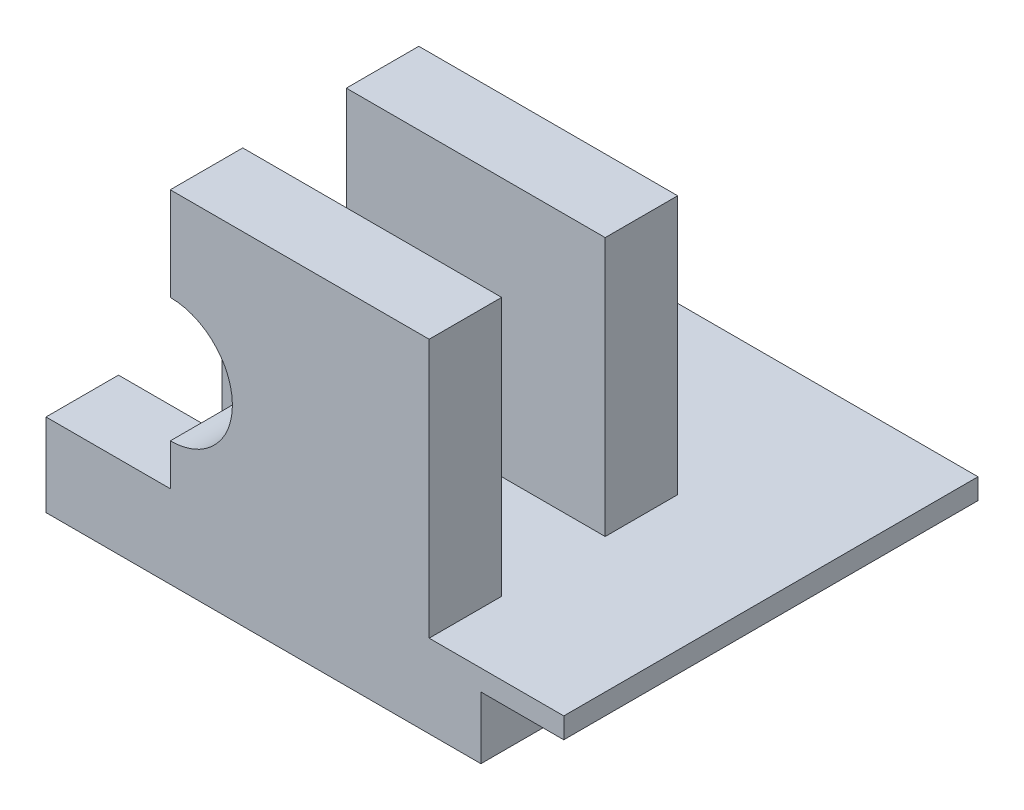
ISO-10303-21;
HEADER;
FILE_DESCRIPTION(('STEP AP214'),'2;1');
FILE_NAME('part.step','',(''),(''),'','','');
FILE_SCHEMA(('AUTOMOTIVE_DESIGN { 1 0 10303 214 1 1 1 1 }'));
ENDSEC;
DATA;
#1=APPLICATION_CONTEXT('core data for automotive mechanical design processes');
#2=APPLICATION_PROTOCOL_DEFINITION('international standard','automotive_design',2000,#1);
#3=PRODUCT_CONTEXT('',#1,'mechanical');
#4=PRODUCT('Part','Part','',(#3));
#5=PRODUCT_RELATED_PRODUCT_CATEGORY('part','',(#4));
#6=PRODUCT_DEFINITION_FORMATION('','',#4);
#7=PRODUCT_DEFINITION_CONTEXT('part definition',#1,'design');
#8=PRODUCT_DEFINITION('design','',#6,#7);
#9=PRODUCT_DEFINITION_SHAPE('','',#8);
#10=(LENGTH_UNIT() NAMED_UNIT(*) SI_UNIT(.MILLI.,.METRE.));
#11=(NAMED_UNIT(*) PLANE_ANGLE_UNIT() SI_UNIT($,.RADIAN.));
#12=(NAMED_UNIT(*) SI_UNIT($,.STERADIAN.) SOLID_ANGLE_UNIT());
#13=UNCERTAINTY_MEASURE_WITH_UNIT(LENGTH_MEASURE(1.E-05),#10,'distance_accuracy_value','');
#14=(GEOMETRIC_REPRESENTATION_CONTEXT(3) GLOBAL_UNCERTAINTY_ASSIGNED_CONTEXT((#13)) GLOBAL_UNIT_ASSIGNED_CONTEXT((#10,
#11,#12)) REPRESENTATION_CONTEXT('',''));
#15=CARTESIAN_POINT('',(0.,0.,0.));
#16=DIRECTION('',(0.,0.,1.));
#17=DIRECTION('',(1.,0.,0.));
#18=AXIS2_PLACEMENT_3D('',#15,#16,#17);
#19=CARTESIAN_POINT('',(-13.,29.,23.));
#20=DIRECTION('',(1.,0.,0.));
#21=DIRECTION('',(0.,0.,-1.));
#22=AXIS2_PLACEMENT_3D('',#19,#20,#21);
#23=PLANE('',#22);
#24=DIRECTION('',(0.,-1.,0.));
#25=VECTOR('',#24,1.);
#26=CARTESIAN_POINT('',(-13.,29.,16.));
#27=LINE('',#26,#25);
#28=CARTESIAN_POINT('',(-13.,29.,16.));
#29=VERTEX_POINT('',#28);
#30=CARTESIAN_POINT('',(-13.,16.,16.));
#31=VERTEX_POINT('',#30);
#32=EDGE_CURVE('E302',#29,#31,#27,.T.);
#33=ORIENTED_EDGE('',*,*,#32,.T.);
#34=DIRECTION('',(0.,0.,1.));
#35=VECTOR('',#34,1.);
#36=CARTESIAN_POINT('',(-13.,16.,0.));
#37=LINE('',#36,#35);
#38=CARTESIAN_POINT('',(-13.,16.,23.));
#39=VERTEX_POINT('',#38);
#40=EDGE_CURVE('E269',#31,#39,#37,.T.);
#41=ORIENTED_EDGE('',*,*,#40,.T.);
#42=DIRECTION('',(0.,-1.,0.));
#43=VECTOR('',#42,1.);
#44=CARTESIAN_POINT('',(-13.,29.,23.));
#45=LINE('',#44,#43);
#46=CARTESIAN_POINT('',(-13.,29.,23.));
#47=VERTEX_POINT('',#46);
#48=EDGE_CURVE('E224',#47,#39,#45,.T.);
#49=ORIENTED_EDGE('',*,*,#48,.F.);
#50=DIRECTION('',(0.,0.,1.));
#51=VECTOR('',#50,1.);
#52=CARTESIAN_POINT('',(-13.,29.,23.));
#53=LINE('',#52,#51);
#54=EDGE_CURVE('E283',#29,#47,#53,.T.);
#55=ORIENTED_EDGE('',*,*,#54,.F.);
#56=EDGE_LOOP('',(#33,#41,#49,#55));
#57=FACE_BOUND('',#56,.T.);
#58=ADVANCED_FACE('F34',(#57),#23,.F.);
#59=CARTESIAN_POINT('',(-13.,29.,33.));
#60=DIRECTION('',(1.,0.,0.));
#61=DIRECTION('',(0.,0.,-1.));
#62=AXIS2_PLACEMENT_3D('',#59,#60,#61);
#63=PLANE('',#62);
#64=DIRECTION('',(0.,-1.,0.));
#65=VECTOR('',#64,1.);
#66=CARTESIAN_POINT('',(-13.,29.,33.));
#67=LINE('',#66,#65);
#68=CARTESIAN_POINT('',(-13.,29.,33.));
#69=VERTEX_POINT('',#68);
#70=CARTESIAN_POINT('',(-13.,20.,33.));
#71=VERTEX_POINT('',#70);
#72=EDGE_CURVE('E449',#69,#71,#67,.T.);
#73=ORIENTED_EDGE('',*,*,#72,.T.);
#74=DIRECTION('',(0.,0.,1.));
#75=VECTOR('',#74,1.);
#76=CARTESIAN_POINT('',(-13.,20.,-0.001000000000001));
#77=LINE('',#76,#75);
#78=CARTESIAN_POINT('',(-13.,20.,40.));
#79=VERTEX_POINT('',#78);
#80=EDGE_CURVE('E57',#79,#71,#77,.F.);
#81=ORIENTED_EDGE('',*,*,#80,.F.);
#82=DIRECTION('',(0.,-1.,0.));
#83=VECTOR('',#82,1.);
#84=CARTESIAN_POINT('',(-13.,29.,40.));
#85=LINE('',#84,#83);
#86=CARTESIAN_POINT('',(-13.,29.,40.));
#87=VERTEX_POINT('',#86);
#88=EDGE_CURVE('E256',#87,#79,#85,.T.);
#89=ORIENTED_EDGE('',*,*,#88,.F.);
#90=DIRECTION('',(0.,0.,1.));
#91=VECTOR('',#90,1.);
#92=CARTESIAN_POINT('',(-13.,29.,33.));
#93=LINE('',#92,#91);
#94=EDGE_CURVE('E233',#69,#87,#93,.T.);
#95=ORIENTED_EDGE('',*,*,#94,.F.);
#96=EDGE_LOOP('',(#73,#81,#89,#95));
#97=FACE_BOUND('',#96,.T.);
#98=ADVANCED_FACE('F492',(#97),#63,.F.);
#99=CARTESIAN_POINT('',(0.,4.,40.));
#100=DIRECTION('',(0.,1.,0.));
#101=DIRECTION('',(0.,0.,1.));
#102=AXIS2_PLACEMENT_3D('',#99,#100,#101);
#103=PLANE('',#102);
#104=DIRECTION('',(-1.,0.,0.));
#105=VECTOR('',#104,1.);
#106=CARTESIAN_POINT('',(-25.,4.,23.));
#107=LINE('',#106,#105);
#108=CARTESIAN_POINT('',(-13.,4.,23.));
#109=VERTEX_POINT('',#108);
#110=CARTESIAN_POINT('',(-25.,4.,23.));
#111=VERTEX_POINT('',#110);
#112=EDGE_CURVE('E315',#109,#111,#107,.T.);
#113=ORIENTED_EDGE('',*,*,#112,.F.);
#114=DIRECTION('',(0.,0.,1.));
#115=VECTOR('',#114,1.);
#116=CARTESIAN_POINT('',(-13.,4.,23.));
#117=LINE('',#116,#115);
#118=CARTESIAN_POINT('',(-13.,4.,16.));
#119=VERTEX_POINT('',#118);
#120=EDGE_CURVE('E222',#119,#109,#117,.T.);
#121=ORIENTED_EDGE('',*,*,#120,.F.);
#122=DIRECTION('',(-1.,0.,0.));
#123=VECTOR('',#122,1.);
#124=CARTESIAN_POINT('',(-13.,4.,16.));
#125=LINE('',#124,#123);
#126=CARTESIAN_POINT('',(12.,4.,16.));
#127=VERTEX_POINT('',#126);
#128=EDGE_CURVE('E287',#127,#119,#125,.T.);
#129=ORIENTED_EDGE('',*,*,#128,.F.);
#130=DIRECTION('',(0.,0.,-1.));
#131=VECTOR('',#130,1.);
#132=CARTESIAN_POINT('',(12.,4.,23.));
#133=LINE('',#132,#131);
#134=CARTESIAN_POINT('',(12.,4.,23.));
#135=VERTEX_POINT('',#134);
#136=EDGE_CURVE('E297',#135,#127,#133,.T.);
#137=ORIENTED_EDGE('',*,*,#136,.F.);
#138=DIRECTION('',(1.,0.,0.));
#139=VECTOR('',#138,1.);
#140=CARTESIAN_POINT('',(-13.,4.,23.));
#141=LINE('',#140,#139);
#142=EDGE_CURVE('E295',#109,#135,#141,.T.);
#143=ORIENTED_EDGE('',*,*,#142,.F.);
#144=DIRECTION('',(0.,0.,-1.));
#145=VECTOR('',#144,1.);
#146=CARTESIAN_POINT('',(-13.,4.,33.));
#147=LINE('',#146,#145);
#148=CARTESIAN_POINT('',(-13.,4.,33.));
#149=VERTEX_POINT('',#148);
#150=EDGE_CURVE('E322',#149,#109,#147,.T.);
#151=ORIENTED_EDGE('',*,*,#150,.F.);
#152=DIRECTION('',(-1.,0.,0.));
#153=VECTOR('',#152,1.);
#154=CARTESIAN_POINT('',(-13.,4.,33.));
#155=LINE('',#154,#153);
#156=CARTESIAN_POINT('',(12.,4.,33.));
#157=VERTEX_POINT('',#156);
#158=EDGE_CURVE('E237',#157,#149,#155,.T.);
#159=ORIENTED_EDGE('',*,*,#158,.F.);
#160=DIRECTION('',(0.,0.,-1.));
#161=VECTOR('',#160,1.);
#162=CARTESIAN_POINT('',(12.,4.,33.));
#163=LINE('',#162,#161);
#164=CARTESIAN_POINT('',(12.,4.,40.));
#165=VERTEX_POINT('',#164);
#166=EDGE_CURVE('E251',#165,#157,#163,.T.);
#167=ORIENTED_EDGE('',*,*,#166,.F.);
#168=DIRECTION('',(1.,0.,0.));
#169=VECTOR('',#168,1.);
#170=CARTESIAN_POINT('',(0.,4.,40.));
#171=LINE('',#170,#169);
#172=CARTESIAN_POINT('',(25.,4.,40.));
#173=VERTEX_POINT('',#172);
#174=EDGE_CURVE('E360',#165,#173,#171,.T.);
#175=ORIENTED_EDGE('',*,*,#174,.T.);
#176=DIRECTION('',(0.,0.,-1.));
#177=VECTOR('',#176,1.);
#178=CARTESIAN_POINT('',(25.,4.,40.));
#179=LINE('',#178,#177);
#180=CARTESIAN_POINT('',(25.,4.,0.));
#181=VERTEX_POINT('',#180);
#182=EDGE_CURVE('E384',#173,#181,#179,.T.);
#183=ORIENTED_EDGE('',*,*,#182,.T.);
#184=DIRECTION('',(1.,0.,0.));
#185=VECTOR('',#184,1.);
#186=CARTESIAN_POINT('',(0.,4.,0.));
#187=LINE('',#186,#185);
#188=CARTESIAN_POINT('',(-7.5,4.,0.));
#189=VERTEX_POINT('',#188);
#190=EDGE_CURVE('E399',#189,#181,#187,.T.);
#191=ORIENTED_EDGE('',*,*,#190,.F.);
#192=CARTESIAN_POINT('',(-15.,4.,0.));
#193=DIRECTION('',(0.,1.,0.));
#194=DIRECTION('',(0.,0.,1.));
#195=AXIS2_PLACEMENT_3D('',#192,#193,#194);
#196=CIRCLE('',#195,7.5);
#197=CARTESIAN_POINT('',(-22.5,4.,0.));
#198=VERTEX_POINT('',#197);
#199=EDGE_CURVE('E334',#198,#189,#196,.T.);
#200=ORIENTED_EDGE('',*,*,#199,.F.);
#201=CARTESIAN_POINT('',(-25.,4.,0.));
#202=VERTEX_POINT('',#201);
#203=EDGE_CURVE('E396',#202,#198,#187,.T.);
#204=ORIENTED_EDGE('',*,*,#203,.F.);
#205=DIRECTION('',(0.,0.,-1.));
#206=VECTOR('',#205,1.);
#207=CARTESIAN_POINT('',(-25.,4.,40.));
#208=LINE('',#207,#206);
#209=EDGE_CURVE('E317',#111,#202,#208,.T.);
#210=ORIENTED_EDGE('',*,*,#209,.F.);
#211=EDGE_LOOP('',(#113,#121,#129,#137,#143,#151,#159,#167,#175,#183,#191,#200,#204,#210));
#212=FACE_BOUND('',#211,.T.);
#213=ADVANCED_FACE('F313',(#212),#103,.T.);
#214=DIRECTION('',(0.,0.,1.));
#215=VECTOR('',#214,1.);
#216=CARTESIAN_POINT('',(-13.,4.,33.));
#217=LINE('',#216,#215);
#218=CARTESIAN_POINT('',(-13.,4.,40.));
#219=VERTEX_POINT('',#218);
#220=EDGE_CURVE('E227',#149,#219,#217,.T.);
#221=ORIENTED_EDGE('',*,*,#220,.F.);
#222=DIRECTION('',(1.,0.,0.));
#223=VECTOR('',#222,1.);
#224=CARTESIAN_POINT('',(-25.,4.,33.));
#225=LINE('',#224,#223);
#226=CARTESIAN_POINT('',(-25.,4.,33.));
#227=VERTEX_POINT('',#226);
#228=EDGE_CURVE('E328',#227,#149,#225,.T.);
#229=ORIENTED_EDGE('',*,*,#228,.F.);
#230=CARTESIAN_POINT('',(-25.,4.,40.));
#231=VERTEX_POINT('',#230);
#232=EDGE_CURVE('E387',#231,#227,#208,.T.);
#233=ORIENTED_EDGE('',*,*,#232,.F.);
#234=EDGE_CURVE('E369',#231,#219,#171,.T.);
#235=ORIENTED_EDGE('',*,*,#234,.T.);
#236=EDGE_LOOP('',(#221,#229,#233,#235));
#237=FACE_BOUND('',#236,.T.);
#238=ADVANCED_FACE('F441',(#237),#103,.T.);
#239=CARTESIAN_POINT('',(-25.,0.,40.));
#240=DIRECTION('',(-1.,0.,0.));
#241=DIRECTION('',(0.,0.,1.));
#242=AXIS2_PLACEMENT_3D('',#239,#240,#241);
#243=PLANE('',#242);
#244=DIRECTION('',(0.,1.,0.));
#245=VECTOR('',#244,1.);
#246=CARTESIAN_POINT('',(-25.,-4.,23.));
#247=LINE('',#246,#245);
#248=CARTESIAN_POINT('',(-25.,-4.,23.));
#249=VERTEX_POINT('',#248);
#250=EDGE_CURVE('E332',#249,#111,#247,.T.);
#251=ORIENTED_EDGE('',*,*,#250,.T.);
#252=ORIENTED_EDGE('',*,*,#209,.T.);
#253=DIRECTION('',(0.,1.,0.));
#254=VECTOR('',#253,1.);
#255=CARTESIAN_POINT('',(-25.,0.,0.));
#256=LINE('',#255,#254);
#257=CARTESIAN_POINT('',(-25.,-4.,0.));
#258=VERTEX_POINT('',#257);
#259=EDGE_CURVE('E352',#258,#202,#256,.T.);
#260=ORIENTED_EDGE('',*,*,#259,.F.);
#261=DIRECTION('',(0.,0.,-1.));
#262=VECTOR('',#261,1.);
#263=CARTESIAN_POINT('',(-25.,-4.,40.));
#264=LINE('',#263,#262);
#265=EDGE_CURVE('E393',#249,#258,#264,.T.);
#266=ORIENTED_EDGE('',*,*,#265,.F.);
#267=EDGE_LOOP('',(#251,#252,#260,#266));
#268=FACE_BOUND('',#267,.T.);
#269=ADVANCED_FACE('F537',(#268),#243,.T.);
#270=CARTESIAN_POINT('',(0.,0.,0.));
#271=DIRECTION('',(0.,0.,1.));
#272=DIRECTION('',(1.,0.,0.));
#273=AXIS2_PLACEMENT_3D('',#270,#271,#272);
#274=PLANE('',#273);
#275=DIRECTION('',(1.,0.,0.));
#276=VECTOR('',#275,1.);
#277=CARTESIAN_POINT('',(0.,-4.,0.));
#278=LINE('',#277,#276);
#279=CARTESIAN_POINT('',(-7.5,-4.,0.));
#280=VERTEX_POINT('',#279);
#281=CARTESIAN_POINT('',(17.,-4.,0.));
#282=VERTEX_POINT('',#281);
#283=EDGE_CURVE('E346',#280,#282,#278,.T.);
#284=ORIENTED_EDGE('',*,*,#283,.F.);
#285=DIRECTION('',(0.,1.,0.));
#286=VECTOR('',#285,1.);
#287=CARTESIAN_POINT('',(-7.5,-4.,0.));
#288=LINE('',#287,#286);
#289=EDGE_CURVE('E258',#280,#189,#288,.T.);
#290=ORIENTED_EDGE('',*,*,#289,.T.);
#291=ORIENTED_EDGE('',*,*,#190,.T.);
#292=DIRECTION('',(0.,1.,0.));
#293=VECTOR('',#292,1.);
#294=CARTESIAN_POINT('',(25.,0.,0.));
#295=LINE('',#294,#293);
#296=CARTESIAN_POINT('',(25.,2.,0.));
#297=VERTEX_POINT('',#296);
#298=EDGE_CURVE('E400',#297,#181,#295,.T.);
#299=ORIENTED_EDGE('',*,*,#298,.F.);
#300=DIRECTION('',(-1.,0.,0.));
#301=VECTOR('',#300,1.);
#302=CARTESIAN_POINT('',(0.,2.,0.));
#303=LINE('',#302,#301);
#304=CARTESIAN_POINT('',(17.,2.,0.));
#305=VERTEX_POINT('',#304);
#306=EDGE_CURVE('E403',#297,#305,#303,.T.);
#307=ORIENTED_EDGE('',*,*,#306,.T.);
#308=DIRECTION('',(0.,1.,0.));
#309=VECTOR('',#308,1.);
#310=CARTESIAN_POINT('',(17.,0.,0.));
#311=LINE('',#310,#309);
#312=EDGE_CURVE('E406',#282,#305,#311,.T.);
#313=ORIENTED_EDGE('',*,*,#312,.F.);
#314=EDGE_LOOP('',(#284,#290,#291,#299,#307,#313));
#315=FACE_BOUND('',#314,.T.);
#316=ADVANCED_FACE('F418',(#315),#274,.F.);
#317=CARTESIAN_POINT('',(0.,-4.,40.));
#318=DIRECTION('',(0.,1.,0.));
#319=DIRECTION('',(0.,0.,1.));
#320=AXIS2_PLACEMENT_3D('',#317,#318,#319);
#321=PLANE('',#320);
#322=DIRECTION('',(0.,0.,-1.));
#323=VECTOR('',#322,1.);
#324=CARTESIAN_POINT('',(-13.,-4.,33.));
#325=LINE('',#324,#323);
#326=CARTESIAN_POINT('',(-13.,-4.,33.));
#327=VERTEX_POINT('',#326);
#328=CARTESIAN_POINT('',(-13.,-4.,23.));
#329=VERTEX_POINT('',#328);
#330=EDGE_CURVE('E325',#327,#329,#325,.T.);
#331=ORIENTED_EDGE('',*,*,#330,.T.);
#332=DIRECTION('',(-1.,0.,0.));
#333=VECTOR('',#332,1.);
#334=CARTESIAN_POINT('',(-25.,-4.,23.));
#335=LINE('',#334,#333);
#336=EDGE_CURVE('E342',#329,#249,#335,.T.);
#337=ORIENTED_EDGE('',*,*,#336,.T.);
#338=ORIENTED_EDGE('',*,*,#265,.T.);
#339=CARTESIAN_POINT('',(-22.5,-4.,0.));
#340=VERTEX_POINT('',#339);
#341=EDGE_CURVE('E408',#258,#340,#278,.T.);
#342=ORIENTED_EDGE('',*,*,#341,.T.);
#343=CARTESIAN_POINT('',(-15.,-4.,0.));
#344=DIRECTION('',(0.,1.,0.));
#345=DIRECTION('',(0.,0.,1.));
#346=AXIS2_PLACEMENT_3D('',#343,#344,#345);
#347=CIRCLE('',#346,7.5);
#348=EDGE_CURVE('E343',#340,#280,#347,.T.);
#349=ORIENTED_EDGE('',*,*,#348,.T.);
#350=ORIENTED_EDGE('',*,*,#283,.T.);
#351=DIRECTION('',(0.,0.,-1.));
#352=VECTOR('',#351,1.);
#353=CARTESIAN_POINT('',(17.,-4.,40.));
#354=LINE('',#353,#352);
#355=CARTESIAN_POINT('',(17.,-4.,40.));
#356=VERTEX_POINT('',#355);
#357=EDGE_CURVE('E377',#356,#282,#354,.T.);
#358=ORIENTED_EDGE('',*,*,#357,.F.);
#359=DIRECTION('',(1.,0.,0.));
#360=VECTOR('',#359,1.);
#361=CARTESIAN_POINT('',(0.,-4.,40.));
#362=LINE('',#361,#360);
#363=CARTESIAN_POINT('',(-25.,-4.,40.));
#364=VERTEX_POINT('',#363);
#365=EDGE_CURVE('E348',#364,#356,#362,.T.);
#366=ORIENTED_EDGE('',*,*,#365,.F.);
#367=CARTESIAN_POINT('',(-25.,-4.,33.));
#368=VERTEX_POINT('',#367);
#369=EDGE_CURVE('E390',#364,#368,#264,.T.);
#370=ORIENTED_EDGE('',*,*,#369,.T.);
#371=DIRECTION('',(1.,0.,0.));
#372=VECTOR('',#371,1.);
#373=CARTESIAN_POINT('',(-25.,-4.,33.));
#374=LINE('',#373,#372);
#375=EDGE_CURVE('E321',#368,#327,#374,.T.);
#376=ORIENTED_EDGE('',*,*,#375,.T.);
#377=EDGE_LOOP('',(#331,#337,#338,#342,#349,#350,#358,#366,#370,#376));
#378=FACE_BOUND('',#377,.T.);
#379=ADVANCED_FACE('F36',(#378),#321,.F.);
#380=CARTESIAN_POINT('',(17.,0.,40.));
#381=DIRECTION('',(-1.,0.,0.));
#382=DIRECTION('',(0.,0.,1.));
#383=AXIS2_PLACEMENT_3D('',#380,#381,#382);
#384=PLANE('',#383);
#385=ORIENTED_EDGE('',*,*,#312,.T.);
#386=DIRECTION('',(0.,0.,-1.));
#387=VECTOR('',#386,1.);
#388=CARTESIAN_POINT('',(17.,2.,40.));
#389=LINE('',#388,#387);
#390=CARTESIAN_POINT('',(17.,2.,40.));
#391=VERTEX_POINT('',#390);
#392=EDGE_CURVE('E380',#391,#305,#389,.T.);
#393=ORIENTED_EDGE('',*,*,#392,.F.);
#394=DIRECTION('',(0.,1.,0.));
#395=VECTOR('',#394,1.);
#396=CARTESIAN_POINT('',(17.,0.,40.));
#397=LINE('',#396,#395);
#398=EDGE_CURVE('E351',#356,#391,#397,.T.);
#399=ORIENTED_EDGE('',*,*,#398,.F.);
#400=ORIENTED_EDGE('',*,*,#357,.T.);
#401=EDGE_LOOP('',(#385,#393,#399,#400));
#402=FACE_BOUND('',#401,.T.);
#403=ADVANCED_FACE('F423',(#402),#384,.F.);
#404=CARTESIAN_POINT('',(0.,2.,40.));
#405=DIRECTION('',(0.,-1.,0.));
#406=DIRECTION('',(1.,0.,0.));
#407=AXIS2_PLACEMENT_3D('',#404,#405,#406);
#408=PLANE('',#407);
#409=ORIENTED_EDGE('',*,*,#306,.F.);
#410=DIRECTION('',(0.,0.,-1.));
#411=VECTOR('',#410,1.);
#412=CARTESIAN_POINT('',(25.,2.,40.));
#413=LINE('',#412,#411);
#414=CARTESIAN_POINT('',(25.,2.,40.));
#415=VERTEX_POINT('',#414);
#416=EDGE_CURVE('E382',#415,#297,#413,.T.);
#417=ORIENTED_EDGE('',*,*,#416,.F.);
#418=DIRECTION('',(-1.,0.,0.));
#419=VECTOR('',#418,1.);
#420=CARTESIAN_POINT('',(0.,2.,40.));
#421=LINE('',#420,#419);
#422=EDGE_CURVE('E354',#415,#391,#421,.T.);
#423=ORIENTED_EDGE('',*,*,#422,.T.);
#424=ORIENTED_EDGE('',*,*,#392,.T.);
#425=EDGE_LOOP('',(#409,#417,#423,#424));
#426=FACE_BOUND('',#425,.T.);
#427=ADVANCED_FACE('F483',(#426),#408,.T.);
#428=CARTESIAN_POINT('',(25.,0.,40.));
#429=DIRECTION('',(-1.,0.,0.));
#430=DIRECTION('',(0.,0.,1.));
#431=AXIS2_PLACEMENT_3D('',#428,#429,#430);
#432=PLANE('',#431);
#433=ORIENTED_EDGE('',*,*,#298,.T.);
#434=ORIENTED_EDGE('',*,*,#182,.F.);
#435=DIRECTION('',(0.,1.,0.));
#436=VECTOR('',#435,1.);
#437=CARTESIAN_POINT('',(25.,0.,40.));
#438=LINE('',#437,#436);
#439=EDGE_CURVE('E357',#415,#173,#438,.T.);
#440=ORIENTED_EDGE('',*,*,#439,.F.);
#441=ORIENTED_EDGE('',*,*,#416,.T.);
#442=EDGE_LOOP('',(#433,#434,#440,#441));
#443=FACE_BOUND('',#442,.T.);
#444=ADVANCED_FACE('F481',(#443),#432,.F.);
#445=DIRECTION('',(0.,1.,0.));
#446=VECTOR('',#445,1.);
#447=CARTESIAN_POINT('',(-25.,-4.,33.));
#448=LINE('',#447,#446);
#449=EDGE_CURVE('E340',#368,#227,#448,.T.);
#450=ORIENTED_EDGE('',*,*,#449,.F.);
#451=ORIENTED_EDGE('',*,*,#369,.F.);
#452=DIRECTION('',(0.,1.,0.));
#453=VECTOR('',#452,1.);
#454=CARTESIAN_POINT('',(-25.,0.,40.));
#455=LINE('',#454,#453);
#456=EDGE_CURVE('E363',#364,#231,#455,.T.);
#457=ORIENTED_EDGE('',*,*,#456,.T.);
#458=ORIENTED_EDGE('',*,*,#232,.T.);
#459=EDGE_LOOP('',(#450,#451,#457,#458));
#460=FACE_BOUND('',#459,.T.);
#461=ADVANCED_FACE('F433',(#460),#243,.T.);
#462=CARTESIAN_POINT('',(0.,0.,40.));
#463=DIRECTION('',(0.,0.,1.));
#464=DIRECTION('',(1.,0.,0.));
#465=AXIS2_PLACEMENT_3D('',#462,#463,#464);
#466=PLANE('',#465);
#467=CARTESIAN_POINT('',(-13.,14.,40.));
#468=DIRECTION('',(0.,0.,1.));
#469=DIRECTION('',(1.,0.,0.));
#470=AXIS2_PLACEMENT_3D('',#467,#468,#469);
#471=CIRCLE('',#470,6.);
#472=CARTESIAN_POINT('',(-13.,8.,40.));
#473=VERTEX_POINT('',#472);
#474=EDGE_CURVE('E279',#473,#79,#471,.T.);
#475=ORIENTED_EDGE('',*,*,#474,.F.);
#476=EDGE_CURVE('E254',#473,#219,#85,.T.);
#477=ORIENTED_EDGE('',*,*,#476,.T.);
#478=ORIENTED_EDGE('',*,*,#234,.F.);
#479=ORIENTED_EDGE('',*,*,#456,.F.);
#480=ORIENTED_EDGE('',*,*,#365,.T.);
#481=ORIENTED_EDGE('',*,*,#398,.T.);
#482=ORIENTED_EDGE('',*,*,#422,.F.);
#483=ORIENTED_EDGE('',*,*,#439,.T.);
#484=ORIENTED_EDGE('',*,*,#174,.F.);
#485=DIRECTION('',(0.,-1.,0.));
#486=VECTOR('',#485,1.);
#487=CARTESIAN_POINT('',(12.,29.,40.));
#488=LINE('',#487,#486);
#489=CARTESIAN_POINT('',(12.,29.,40.));
#490=VERTEX_POINT('',#489);
#491=EDGE_CURVE('E257',#490,#165,#488,.T.);
#492=ORIENTED_EDGE('',*,*,#491,.F.);
#493=DIRECTION('',(1.,0.,0.));
#494=VECTOR('',#493,1.);
#495=CARTESIAN_POINT('',(-13.,29.,40.));
#496=LINE('',#495,#494);
#497=EDGE_CURVE('E236',#87,#490,#496,.T.);
#498=ORIENTED_EDGE('',*,*,#497,.F.);
#499=ORIENTED_EDGE('',*,*,#88,.T.);
#500=EDGE_LOOP('',(#475,#477,#478,#479,#480,#481,#482,#483,#484,#492,#498,#499));
#501=FACE_BOUND('',#500,.T.);
#502=ADVANCED_FACE('F428',(#501),#466,.T.);
#503=ORIENTED_EDGE('',*,*,#203,.T.);
#504=DIRECTION('',(0.,1.,0.));
#505=VECTOR('',#504,1.);
#506=CARTESIAN_POINT('',(-22.5,-4.,0.));
#507=LINE('',#506,#505);
#508=EDGE_CURVE('E374',#198,#340,#507,.F.);
#509=ORIENTED_EDGE('',*,*,#508,.T.);
#510=ORIENTED_EDGE('',*,*,#341,.F.);
#511=ORIENTED_EDGE('',*,*,#259,.T.);
#512=EDGE_LOOP('',(#503,#509,#510,#511));
#513=FACE_BOUND('',#512,.T.);
#514=ADVANCED_FACE('F528',(#513),#274,.F.);
#515=CARTESIAN_POINT('',(-15.,-4.,0.));
#516=DIRECTION('',(0.,1.,0.));
#517=DIRECTION('',(0.,0.,1.));
#518=AXIS2_PLACEMENT_3D('',#515,#516,#517);
#519=CYLINDRICAL_SURFACE('',#518,7.5);
#520=ORIENTED_EDGE('',*,*,#348,.F.);
#521=ORIENTED_EDGE('',*,*,#508,.F.);
#522=ORIENTED_EDGE('',*,*,#199,.T.);
#523=ORIENTED_EDGE('',*,*,#289,.F.);
#524=EDGE_LOOP('',(#520,#521,#522,#523));
#525=FACE_BOUND('',#524,.T.);
#526=ADVANCED_FACE('F520',(#525),#519,.F.);
#527=CARTESIAN_POINT('',(-25.,-4.,23.));
#528=DIRECTION('',(0.,0.,-1.));
#529=DIRECTION('',(-1.,0.,0.));
#530=AXIS2_PLACEMENT_3D('',#527,#528,#529);
#531=PLANE('',#530);
#532=ORIENTED_EDGE('',*,*,#112,.T.);
#533=ORIENTED_EDGE('',*,*,#250,.F.);
#534=ORIENTED_EDGE('',*,*,#336,.F.);
#535=DIRECTION('',(0.,1.,0.));
#536=VECTOR('',#535,1.);
#537=CARTESIAN_POINT('',(-13.,-4.,23.));
#538=LINE('',#537,#536);
#539=EDGE_CURVE('E335',#329,#109,#538,.T.);
#540=ORIENTED_EDGE('',*,*,#539,.T.);
#541=EDGE_LOOP('',(#532,#533,#534,#540));
#542=FACE_BOUND('',#541,.T.);
#543=ADVANCED_FACE('F516',(#542),#531,.F.);
#544=CARTESIAN_POINT('',(-13.,-4.,33.));
#545=DIRECTION('',(1.,0.,0.));
#546=DIRECTION('',(0.,0.,-1.));
#547=AXIS2_PLACEMENT_3D('',#544,#545,#546);
#548=PLANE('',#547);
#549=ORIENTED_EDGE('',*,*,#150,.T.);
#550=ORIENTED_EDGE('',*,*,#539,.F.);
#551=ORIENTED_EDGE('',*,*,#330,.F.);
#552=DIRECTION('',(0.,1.,0.));
#553=VECTOR('',#552,1.);
#554=CARTESIAN_POINT('',(-13.,-4.,33.));
#555=LINE('',#554,#553);
#556=EDGE_CURVE('E337',#327,#149,#555,.T.);
#557=ORIENTED_EDGE('',*,*,#556,.T.);
#558=EDGE_LOOP('',(#549,#550,#551,#557));
#559=FACE_BOUND('',#558,.T.);
#560=ADVANCED_FACE('F519',(#559),#548,.F.);
#561=CARTESIAN_POINT('',(-25.,-4.,33.));
#562=DIRECTION('',(0.,0.,1.));
#563=DIRECTION('',(1.,0.,0.));
#564=AXIS2_PLACEMENT_3D('',#561,#562,#563);
#565=PLANE('',#564);
#566=ORIENTED_EDGE('',*,*,#228,.T.);
#567=ORIENTED_EDGE('',*,*,#556,.F.);
#568=ORIENTED_EDGE('',*,*,#375,.F.);
#569=ORIENTED_EDGE('',*,*,#449,.T.);
#570=EDGE_LOOP('',(#566,#567,#568,#569));
#571=FACE_BOUND('',#570,.T.);
#572=ADVANCED_FACE('F437',(#571),#565,.F.);
#573=ORIENTED_EDGE('',*,*,#476,.F.);
#574=DIRECTION('',(0.,0.,1.));
#575=VECTOR('',#574,1.);
#576=CARTESIAN_POINT('',(-13.,8.,-0.001000000000001));
#577=LINE('',#576,#575);
#578=CARTESIAN_POINT('',(-13.,8.,33.));
#579=VERTEX_POINT('',#578);
#580=EDGE_CURVE('E272',#579,#473,#577,.T.);
#581=ORIENTED_EDGE('',*,*,#580,.F.);
#582=EDGE_CURVE('E243',#579,#149,#67,.T.);
#583=ORIENTED_EDGE('',*,*,#582,.T.);
#584=ORIENTED_EDGE('',*,*,#220,.T.);
#585=EDGE_LOOP('',(#573,#581,#583,#584));
#586=FACE_BOUND('',#585,.T.);
#587=ADVANCED_FACE('F458',(#586),#63,.F.);
#588=CARTESIAN_POINT('',(12.,29.,33.));
#589=DIRECTION('',(-1.,0.,0.));
#590=DIRECTION('',(0.,0.,1.));
#591=AXIS2_PLACEMENT_3D('',#588,#589,#590);
#592=PLANE('',#591);
#593=ORIENTED_EDGE('',*,*,#166,.T.);
#594=DIRECTION('',(0.,-1.,0.));
#595=VECTOR('',#594,1.);
#596=CARTESIAN_POINT('',(12.,29.,33.));
#597=LINE('',#596,#595);
#598=CARTESIAN_POINT('',(12.,29.,33.));
#599=VERTEX_POINT('',#598);
#600=EDGE_CURVE('E447',#599,#157,#597,.T.);
#601=ORIENTED_EDGE('',*,*,#600,.F.);
#602=DIRECTION('',(0.,0.,-1.));
#603=VECTOR('',#602,1.);
#604=CARTESIAN_POINT('',(12.,29.,33.));
#605=LINE('',#604,#603);
#606=EDGE_CURVE('E239',#490,#599,#605,.T.);
#607=ORIENTED_EDGE('',*,*,#606,.F.);
#608=ORIENTED_EDGE('',*,*,#491,.T.);
#609=EDGE_LOOP('',(#593,#601,#607,#608));
#610=FACE_BOUND('',#609,.T.);
#611=ADVANCED_FACE('F474',(#610),#592,.F.);
#612=CARTESIAN_POINT('',(-13.,29.,33.));
#613=DIRECTION('',(0.,0.,1.));
#614=DIRECTION('',(1.,0.,0.));
#615=AXIS2_PLACEMENT_3D('',#612,#613,#614);
#616=PLANE('',#615);
#617=ORIENTED_EDGE('',*,*,#582,.F.);
#618=CARTESIAN_POINT('',(-13.,14.,33.));
#619=DIRECTION('',(0.,0.,1.));
#620=DIRECTION('',(1.,0.,0.));
#621=AXIS2_PLACEMENT_3D('',#618,#619,#620);
#622=CIRCLE('',#621,6.);
#623=EDGE_CURVE('E281',#71,#579,#622,.F.);
#624=ORIENTED_EDGE('',*,*,#623,.F.);
#625=ORIENTED_EDGE('',*,*,#72,.F.);
#626=DIRECTION('',(-1.,0.,0.));
#627=VECTOR('',#626,1.);
#628=CARTESIAN_POINT('',(-13.,29.,33.));
#629=LINE('',#628,#627);
#630=EDGE_CURVE('E241',#599,#69,#629,.T.);
#631=ORIENTED_EDGE('',*,*,#630,.F.);
#632=ORIENTED_EDGE('',*,*,#600,.T.);
#633=ORIENTED_EDGE('',*,*,#158,.T.);
#634=EDGE_LOOP('',(#617,#624,#625,#631,#632,#633));
#635=FACE_BOUND('',#634,.T.);
#636=ADVANCED_FACE('F461',(#635),#616,.F.);
#637=CARTESIAN_POINT('',(0.,29.,0.));
#638=DIRECTION('',(0.,1.,0.));
#639=DIRECTION('',(0.,0.,1.));
#640=AXIS2_PLACEMENT_3D('',#637,#638,#639);
#641=PLANE('',#640);
#642=ORIENTED_EDGE('',*,*,#94,.T.);
#643=ORIENTED_EDGE('',*,*,#497,.T.);
#644=ORIENTED_EDGE('',*,*,#606,.T.);
#645=ORIENTED_EDGE('',*,*,#630,.T.);
#646=EDGE_LOOP('',(#642,#643,#644,#645));
#647=FACE_BOUND('',#646,.T.);
#648=ADVANCED_FACE('F502',(#647),#641,.T.);
#649=CARTESIAN_POINT('',(-13.,8.,23.));
#650=VERTEX_POINT('',#649);
#651=EDGE_CURVE('E214',#650,#109,#45,.T.);
#652=ORIENTED_EDGE('',*,*,#651,.F.);
#653=DIRECTION('',(0.,0.,1.));
#654=VECTOR('',#653,1.);
#655=CARTESIAN_POINT('',(-13.,8.,0.));
#656=LINE('',#655,#654);
#657=CARTESIAN_POINT('',(-13.,8.,16.));
#658=VERTEX_POINT('',#657);
#659=EDGE_CURVE('E199',#658,#650,#656,.T.);
#660=ORIENTED_EDGE('',*,*,#659,.F.);
#661=EDGE_CURVE('E293',#658,#119,#27,.T.);
#662=ORIENTED_EDGE('',*,*,#661,.T.);
#663=ORIENTED_EDGE('',*,*,#120,.T.);
#664=EDGE_LOOP('',(#652,#660,#662,#663));
#665=FACE_BOUND('',#664,.T.);
#666=ADVANCED_FACE('F220',(#665),#23,.F.);
#667=CARTESIAN_POINT('',(-13.,29.,23.));
#668=DIRECTION('',(0.,0.,-1.));
#669=DIRECTION('',(-1.,0.,0.));
#670=AXIS2_PLACEMENT_3D('',#667,#668,#669);
#671=PLANE('',#670);
#672=ORIENTED_EDGE('',*,*,#48,.T.);
#673=DIRECTION('',(-1.,0.,0.));
#674=VECTOR('',#673,1.);
#675=CARTESIAN_POINT('',(-13.,16.,23.));
#676=LINE('',#675,#674);
#677=CARTESIAN_POINT('',(-5.,16.,23.));
#678=VERTEX_POINT('',#677);
#679=EDGE_CURVE('E209',#678,#39,#676,.T.);
#680=ORIENTED_EDGE('',*,*,#679,.F.);
#681=DIRECTION('',(0.,1.,0.));
#682=VECTOR('',#681,1.);
#683=CARTESIAN_POINT('',(-5.,8.,23.));
#684=LINE('',#683,#682);
#685=CARTESIAN_POINT('',(-5.,8.,23.));
#686=VERTEX_POINT('',#685);
#687=EDGE_CURVE('E218',#686,#678,#684,.T.);
#688=ORIENTED_EDGE('',*,*,#687,.F.);
#689=DIRECTION('',(1.,0.,0.));
#690=VECTOR('',#689,1.);
#691=CARTESIAN_POINT('',(-13.,8.,23.));
#692=LINE('',#691,#690);
#693=EDGE_CURVE('E202',#650,#686,#692,.T.);
#694=ORIENTED_EDGE('',*,*,#693,.F.);
#695=ORIENTED_EDGE('',*,*,#651,.T.);
#696=ORIENTED_EDGE('',*,*,#142,.T.);
#697=DIRECTION('',(0.,-1.,0.));
#698=VECTOR('',#697,1.);
#699=CARTESIAN_POINT('',(12.,29.,23.));
#700=LINE('',#699,#698);
#701=CARTESIAN_POINT('',(12.,29.,23.));
#702=VERTEX_POINT('',#701);
#703=EDGE_CURVE('E225',#702,#135,#700,.T.);
#704=ORIENTED_EDGE('',*,*,#703,.F.);
#705=DIRECTION('',(1.,0.,0.));
#706=VECTOR('',#705,1.);
#707=CARTESIAN_POINT('',(-13.,29.,23.));
#708=LINE('',#707,#706);
#709=EDGE_CURVE('E286',#47,#702,#708,.T.);
#710=ORIENTED_EDGE('',*,*,#709,.F.);
#711=EDGE_LOOP('',(#672,#680,#688,#694,#695,#696,#704,#710));
#712=FACE_BOUND('',#711,.T.);
#713=ADVANCED_FACE('F213',(#712),#671,.F.);
#714=CARTESIAN_POINT('',(12.,29.,23.));
#715=DIRECTION('',(-1.,0.,0.));
#716=DIRECTION('',(0.,0.,1.));
#717=AXIS2_PLACEMENT_3D('',#714,#715,#716);
#718=PLANE('',#717);
#719=ORIENTED_EDGE('',*,*,#136,.T.);
#720=DIRECTION('',(0.,-1.,0.));
#721=VECTOR('',#720,1.);
#722=CARTESIAN_POINT('',(12.,29.,16.));
#723=LINE('',#722,#721);
#724=CARTESIAN_POINT('',(12.,29.,16.));
#725=VERTEX_POINT('',#724);
#726=EDGE_CURVE('E229',#725,#127,#723,.T.);
#727=ORIENTED_EDGE('',*,*,#726,.F.);
#728=DIRECTION('',(0.,0.,-1.));
#729=VECTOR('',#728,1.);
#730=CARTESIAN_POINT('',(12.,29.,23.));
#731=LINE('',#730,#729);
#732=EDGE_CURVE('E289',#702,#725,#731,.T.);
#733=ORIENTED_EDGE('',*,*,#732,.F.);
#734=ORIENTED_EDGE('',*,*,#703,.T.);
#735=EDGE_LOOP('',(#719,#727,#733,#734));
#736=FACE_BOUND('',#735,.T.);
#737=ADVANCED_FACE('F309',(#736),#718,.F.);
#738=CARTESIAN_POINT('',(-13.,29.,16.));
#739=DIRECTION('',(0.,0.,1.));
#740=DIRECTION('',(1.,0.,0.));
#741=AXIS2_PLACEMENT_3D('',#738,#739,#740);
#742=PLANE('',#741);
#743=DIRECTION('',(0.,1.,0.));
#744=VECTOR('',#743,1.);
#745=CARTESIAN_POINT('',(-5.,29.,16.));
#746=LINE('',#745,#744);
#747=CARTESIAN_POINT('',(-5.,8.,16.));
#748=VERTEX_POINT('',#747);
#749=CARTESIAN_POINT('',(-5.,16.,16.));
#750=VERTEX_POINT('',#749);
#751=EDGE_CURVE('E42',#748,#750,#746,.T.);
#752=ORIENTED_EDGE('',*,*,#751,.T.);
#753=DIRECTION('',(-1.,0.,0.));
#754=VECTOR('',#753,1.);
#755=CARTESIAN_POINT('',(-13.,16.,16.));
#756=LINE('',#755,#754);
#757=EDGE_CURVE('E11',#750,#31,#756,.T.);
#758=ORIENTED_EDGE('',*,*,#757,.T.);
#759=ORIENTED_EDGE('',*,*,#32,.F.);
#760=DIRECTION('',(-1.,0.,0.));
#761=VECTOR('',#760,1.);
#762=CARTESIAN_POINT('',(-13.,29.,16.));
#763=LINE('',#762,#761);
#764=EDGE_CURVE('E291',#725,#29,#763,.T.);
#765=ORIENTED_EDGE('',*,*,#764,.F.);
#766=ORIENTED_EDGE('',*,*,#726,.T.);
#767=ORIENTED_EDGE('',*,*,#128,.T.);
#768=ORIENTED_EDGE('',*,*,#661,.F.);
#769=DIRECTION('',(1.,0.,0.));
#770=VECTOR('',#769,1.);
#771=CARTESIAN_POINT('',(-13.,8.,16.));
#772=LINE('',#771,#770);
#773=EDGE_CURVE('E205',#658,#748,#772,.T.);
#774=ORIENTED_EDGE('',*,*,#773,.T.);
#775=EDGE_LOOP('',(#752,#758,#759,#765,#766,#767,#768,#774));
#776=FACE_BOUND('',#775,.T.);
#777=ADVANCED_FACE('F261',(#776),#742,.F.);
#778=CARTESIAN_POINT('',(0.,29.,0.));
#779=DIRECTION('',(0.,-1.,0.));
#780=DIRECTION('',(0.,0.,-1.));
#781=AXIS2_PLACEMENT_3D('',#778,#779,#780);
#782=PLANE('',#781);
#783=ORIENTED_EDGE('',*,*,#54,.T.);
#784=ORIENTED_EDGE('',*,*,#709,.T.);
#785=ORIENTED_EDGE('',*,*,#732,.T.);
#786=ORIENTED_EDGE('',*,*,#764,.T.);
#787=EDGE_LOOP('',(#783,#784,#785,#786));
#788=FACE_BOUND('',#787,.T.);
#789=ADVANCED_FACE('F554',(#788),#782,.F.);
#790=CARTESIAN_POINT('',(-13.,14.,-0.001000000000001));
#791=DIRECTION('',(0.,0.,1.));
#792=DIRECTION('',(1.,0.,0.));
#793=AXIS2_PLACEMENT_3D('',#790,#791,#792);
#794=CYLINDRICAL_SURFACE('',#793,6.);
#795=ORIENTED_EDGE('',*,*,#80,.T.);
#796=ORIENTED_EDGE('',*,*,#623,.T.);
#797=ORIENTED_EDGE('',*,*,#580,.T.);
#798=ORIENTED_EDGE('',*,*,#474,.T.);
#799=EDGE_LOOP('',(#795,#796,#797,#798));
#800=FACE_BOUND('',#799,.T.);
#801=ADVANCED_FACE('F560',(#800),#794,.F.);
#802=CARTESIAN_POINT('',(-13.,16.,0.));
#803=DIRECTION('',(0.,1.,0.));
#804=DIRECTION('',(0.,0.,1.));
#805=AXIS2_PLACEMENT_3D('',#802,#803,#804);
#806=PLANE('',#805);
#807=DIRECTION('',(0.,0.,1.));
#808=VECTOR('',#807,1.);
#809=CARTESIAN_POINT('',(-5.,16.,0.));
#810=LINE('',#809,#808);
#811=EDGE_CURVE('E267',#750,#678,#810,.T.);
#812=ORIENTED_EDGE('',*,*,#811,.T.);
#813=ORIENTED_EDGE('',*,*,#679,.T.);
#814=ORIENTED_EDGE('',*,*,#40,.F.);
#815=ORIENTED_EDGE('',*,*,#757,.F.);
#816=EDGE_LOOP('',(#812,#813,#814,#815));
#817=FACE_BOUND('',#816,.T.);
#818=ADVANCED_FACE('F558',(#817),#806,.F.);
#819=CARTESIAN_POINT('',(-5.,8.,0.));
#820=DIRECTION('',(1.,0.,0.));
#821=DIRECTION('',(0.,0.,-1.));
#822=AXIS2_PLACEMENT_3D('',#819,#820,#821);
#823=PLANE('',#822);
#824=DIRECTION('',(0.,0.,1.));
#825=VECTOR('',#824,1.);
#826=CARTESIAN_POINT('',(-5.,8.,0.));
#827=LINE('',#826,#825);
#828=EDGE_CURVE('E49',#748,#686,#827,.T.);
#829=ORIENTED_EDGE('',*,*,#828,.T.);
#830=ORIENTED_EDGE('',*,*,#687,.T.);
#831=ORIENTED_EDGE('',*,*,#811,.F.);
#832=ORIENTED_EDGE('',*,*,#751,.F.);
#833=EDGE_LOOP('',(#829,#830,#831,#832));
#834=FACE_BOUND('',#833,.T.);
#835=ADVANCED_FACE('F266',(#834),#823,.F.);
#836=CARTESIAN_POINT('',(-13.,8.,0.));
#837=DIRECTION('',(0.,-1.,0.));
#838=DIRECTION('',(0.,0.,-1.));
#839=AXIS2_PLACEMENT_3D('',#836,#837,#838);
#840=PLANE('',#839);
#841=ORIENTED_EDGE('',*,*,#659,.T.);
#842=ORIENTED_EDGE('',*,*,#693,.T.);
#843=ORIENTED_EDGE('',*,*,#828,.F.);
#844=ORIENTED_EDGE('',*,*,#773,.F.);
#845=EDGE_LOOP('',(#841,#842,#843,#844));
#846=FACE_BOUND('',#845,.T.);
#847=ADVANCED_FACE('F201',(#846),#840,.F.);
#848=CLOSED_SHELL('',(#58,#98,#213,#238,#269,#316,#379,#403,#427,#444,#461,#502,#514,#526,#543,
#560,#572,#587,#611,#636,#648,#666,#713,#737,#777,#789,#801,#818,#835,#847));
#849=MANIFOLD_SOLID_BREP('B2',#848);
#850=ADVANCED_BREP_SHAPE_REPRESENTATION('',(#18,#849),#14);
#851=SHAPE_DEFINITION_REPRESENTATION(#9,#850);
ENDSEC;
END-ISO-10303-21;
